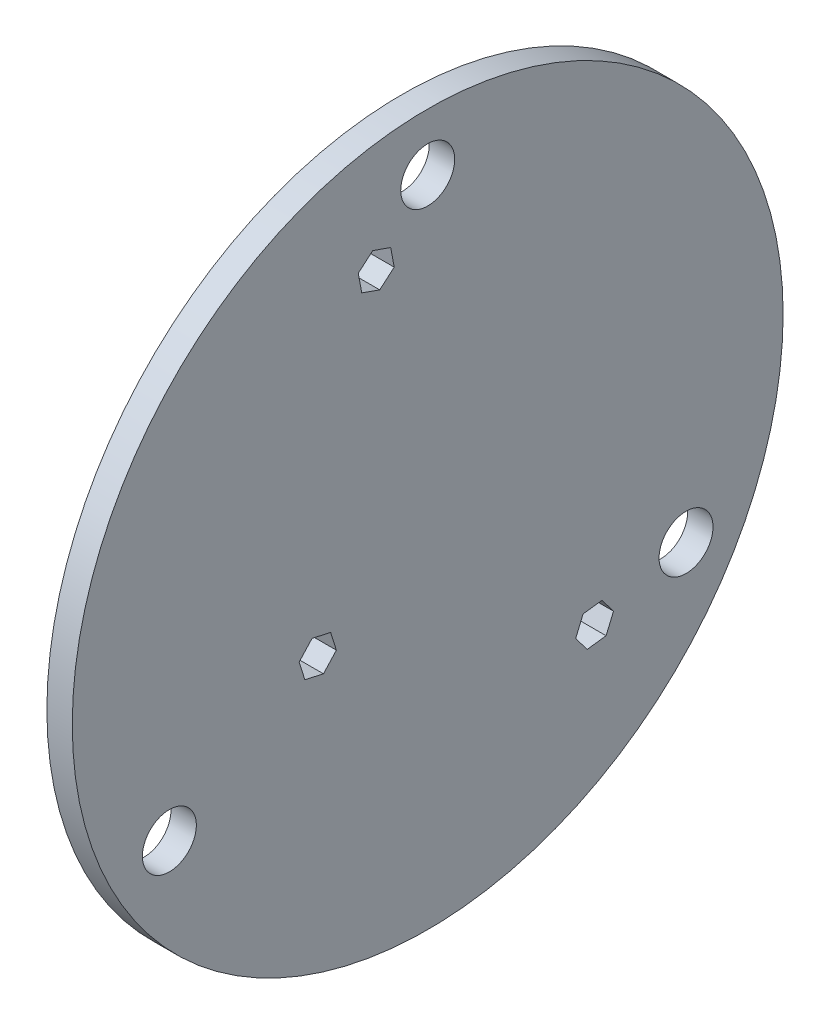
ISO-10303-21;
HEADER;
FILE_DESCRIPTION(('STEP AP214'),'2;1');
FILE_NAME('part.step','',(''),(''),'','','');
FILE_SCHEMA(('AUTOMOTIVE_DESIGN { 1 0 10303 214 1 1 1 1 }'));
ENDSEC;
DATA;
#1=APPLICATION_CONTEXT('core data for automotive mechanical design processes');
#2=APPLICATION_PROTOCOL_DEFINITION('international standard','automotive_design',2000,#1);
#3=PRODUCT_CONTEXT('',#1,'mechanical');
#4=PRODUCT('Part','Part','',(#3));
#5=PRODUCT_RELATED_PRODUCT_CATEGORY('part','',(#4));
#6=PRODUCT_DEFINITION_FORMATION('','',#4);
#7=PRODUCT_DEFINITION_CONTEXT('part definition',#1,'design');
#8=PRODUCT_DEFINITION('design','',#6,#7);
#9=PRODUCT_DEFINITION_SHAPE('','',#8);
#10=(LENGTH_UNIT() NAMED_UNIT(*) SI_UNIT(.MILLI.,.METRE.));
#11=(NAMED_UNIT(*) PLANE_ANGLE_UNIT() SI_UNIT($,.RADIAN.));
#12=(NAMED_UNIT(*) SI_UNIT($,.STERADIAN.) SOLID_ANGLE_UNIT());
#13=UNCERTAINTY_MEASURE_WITH_UNIT(LENGTH_MEASURE(1.E-05),#10,'distance_accuracy_value','');
#14=(GEOMETRIC_REPRESENTATION_CONTEXT(3) GLOBAL_UNCERTAINTY_ASSIGNED_CONTEXT((#13)) GLOBAL_UNIT_ASSIGNED_CONTEXT((#10,
#11,#12)) REPRESENTATION_CONTEXT('',''));
#15=CARTESIAN_POINT('',(0.,0.,0.));
#16=DIRECTION('',(0.,0.,1.));
#17=DIRECTION('',(1.,0.,0.));
#18=AXIS2_PLACEMENT_3D('',#15,#16,#17);
#19=CARTESIAN_POINT('',(4.,0.,0.));
#20=DIRECTION('',(-1.,0.,0.));
#21=DIRECTION('',(0.,0.,1.));
#22=AXIS2_PLACEMENT_3D('',#19,#20,#21);
#23=CYLINDRICAL_SURFACE('',#22,56.);
#24=CARTESIAN_POINT('',(4.,0.,0.));
#25=DIRECTION('',(1.,0.,0.));
#26=DIRECTION('',(0.,0.,-1.));
#27=AXIS2_PLACEMENT_3D('',#24,#25,#26);
#28=CIRCLE('',#27,56.);
#29=CARTESIAN_POINT('',(4.,0.,-56.));
#30=VERTEX_POINT('',#29);
#31=EDGE_CURVE('E11',#30,#30,#28,.T.);
#32=ORIENTED_EDGE('',*,*,#31,.F.);
#33=EDGE_LOOP('',(#32));
#34=FACE_BOUND('',#33,.T.);
#35=CARTESIAN_POINT('',(0.,0.,0.));
#36=DIRECTION('',(1.,0.,0.));
#37=DIRECTION('',(0.,0.,-1.));
#38=AXIS2_PLACEMENT_3D('',#35,#36,#37);
#39=CIRCLE('',#38,56.);
#40=CARTESIAN_POINT('',(0.,0.,-56.));
#41=VERTEX_POINT('',#40);
#42=EDGE_CURVE('E36',#41,#41,#39,.T.);
#43=ORIENTED_EDGE('',*,*,#42,.T.);
#44=EDGE_LOOP('',(#43));
#45=FACE_BOUND('',#44,.T.);
#46=ADVANCED_FACE('F33',(#34,#45),#23,.T.);
#47=CARTESIAN_POINT('',(4.,0.,0.));
#48=DIRECTION('',(1.,0.,0.));
#49=DIRECTION('',(0.,0.,-1.));
#50=AXIS2_PLACEMENT_3D('',#47,#48,#49);
#51=PLANE('',#50);
#52=DIRECTION('',(0.,-0.983088342629937,-0.183131948564752));
#53=VECTOR('',#52,1.);
#54=CARTESIAN_POINT('',(4.,39.0425213038183,10.9386261729049));
#55=LINE('',#54,#53);
#56=CARTESIAN_POINT('',(4.,39.0425213038183,10.9386261729049));
#57=VERTEX_POINT('',#56);
#58=CARTESIAN_POINT('',(4.,36.0910724436945,10.3888235179393));
#59=VERTEX_POINT('',#58);
#60=EDGE_CURVE('E47',#57,#59,#55,.T.);
#61=ORIENTED_EDGE('',*,*,#60,.F.);
#62=DIRECTION('',(0.,-0.650141091016588,0.759813504599491));
#63=VECTOR('',#62,1.);
#64=CARTESIAN_POINT('',(4.,40.9943888001485,8.6574978095499));
#65=LINE('',#64,#63);
#66=CARTESIAN_POINT('',(4.,40.9943888001485,8.6574978095499));
#67=VERTEX_POINT('',#66);
#68=EDGE_CURVE('E179',#67,#57,#65,.T.);
#69=ORIENTED_EDGE('',*,*,#68,.F.);
#70=DIRECTION('',(0.,0.33294725161335,0.942945453164241));
#71=VECTOR('',#70,1.);
#72=CARTESIAN_POINT('',(4.,39.994807436355,5.82656679122926));
#73=LINE('',#72,#71);
#74=CARTESIAN_POINT('',(4.,39.994807436355,5.82656679122926));
#75=VERTEX_POINT('',#74);
#76=EDGE_CURVE('E182',#75,#67,#73,.T.);
#77=ORIENTED_EDGE('',*,*,#76,.F.);
#78=DIRECTION('',(0.,0.983088342629937,0.183131948564751));
#79=VECTOR('',#78,1.);
#80=CARTESIAN_POINT('',(4.,37.0433585762312,5.27676413626364));
#81=LINE('',#80,#79);
#82=CARTESIAN_POINT('',(4.,37.0433585762312,5.27676413626364));
#83=VERTEX_POINT('',#82);
#84=EDGE_CURVE('E199',#83,#75,#81,.T.);
#85=ORIENTED_EDGE('',*,*,#84,.F.);
#86=DIRECTION('',(0.,0.650141091016587,-0.759813504599492));
#87=VECTOR('',#86,1.);
#88=CARTESIAN_POINT('',(4.,35.0914910799009,7.55789249961868));
#89=LINE('',#88,#87);
#90=CARTESIAN_POINT('',(4.,35.0914910799009,7.55789249961868));
#91=VERTEX_POINT('',#90);
#92=EDGE_CURVE('E196',#91,#83,#89,.T.);
#93=ORIENTED_EDGE('',*,*,#92,.F.);
#94=DIRECTION('',(0.,-0.332947251613348,-0.942945453164242));
#95=VECTOR('',#94,1.);
#96=CARTESIAN_POINT('',(4.,36.0910724436945,10.3888235179393));
#97=LINE('',#96,#95);
#98=EDGE_CURVE('E193',#59,#91,#97,.T.);
#99=ORIENTED_EDGE('',*,*,#98,.F.);
#100=EDGE_LOOP('',(#61,#69,#77,#85,#93,#99));
#101=FACE_BOUND('',#100,.T.);
#102=DIRECTION('',(0.,-0.218737299113197,-0.975783784440315));
#103=VECTOR('',#102,1.);
#104=CARTESIAN_POINT('',(4.,-12.2086889393792,19.3539845329892));
#105=LINE('',#104,#103);
#106=CARTESIAN_POINT('',(4.,-12.2086889393792,19.3539845329892));
#107=VERTEX_POINT('',#106);
#108=CARTESIAN_POINT('',(4.,-12.8653867397082,16.4244655737783));
#109=VERTEX_POINT('',#108);
#110=EDGE_CURVE('E55',#107,#109,#105,.T.);
#111=ORIENTED_EDGE('',*,*,#110,.F.);
#112=DIRECTION('',(0.,-0.95442219548283,-0.298459834432934));
#113=VECTOR('',#112,1.);
#114=CARTESIAN_POINT('',(4.,-9.34330219966986,20.2500270349004));
#115=LINE('',#114,#113);
#116=CARTESIAN_POINT('',(4.,-9.34330219966986,20.2500270349004));
#117=VERTEX_POINT('',#116);
#118=EDGE_CURVE('E218',#117,#107,#115,.T.);
#119=ORIENTED_EDGE('',*,*,#118,.F.);
#120=DIRECTION('',(0.,-0.735684896369631,0.677323950007384));
#121=VECTOR('',#120,1.);
#122=CARTESIAN_POINT('',(4.,-7.13461326028956,18.2165505776006));
#123=LINE('',#122,#121);
#124=CARTESIAN_POINT('',(4.,-7.13461326028956,18.2165505776006));
#125=VERTEX_POINT('',#124);
#126=EDGE_CURVE('E244',#125,#117,#123,.T.);
#127=ORIENTED_EDGE('',*,*,#126,.F.);
#128=DIRECTION('',(0.,0.218737299113197,0.975783784440315));
#129=VECTOR('',#128,1.);
#130=CARTESIAN_POINT('',(4.,-7.7913110606186,15.2870316183896));
#131=LINE('',#130,#129);
#132=CARTESIAN_POINT('',(4.,-7.7913110606186,15.2870316183896));
#133=VERTEX_POINT('',#132);
#134=EDGE_CURVE('E241',#133,#125,#131,.T.);
#135=ORIENTED_EDGE('',*,*,#134,.F.);
#136=DIRECTION('',(0.,0.954422195482831,0.29845983443293));
#137=VECTOR('',#136,1.);
#138=CARTESIAN_POINT('',(4.,-10.656697800328,14.3909891164785));
#139=LINE('',#138,#137);
#140=CARTESIAN_POINT('',(4.,-10.656697800328,14.3909891164785));
#141=VERTEX_POINT('',#140);
#142=EDGE_CURVE('E238',#141,#133,#139,.T.);
#143=ORIENTED_EDGE('',*,*,#142,.F.);
#144=DIRECTION('',(0.,0.735684896369631,-0.677323950007384));
#145=VECTOR('',#144,1.);
#146=CARTESIAN_POINT('',(4.,-12.8653867397082,16.4244655737783));
#147=LINE('',#146,#145);
#148=EDGE_CURVE('E235',#109,#141,#147,.T.);
#149=ORIENTED_EDGE('',*,*,#148,.F.);
#150=EDGE_LOOP('',(#111,#119,#127,#135,#143,#149));
#151=FACE_BOUND('',#150,.T.);
#152=DIRECTION('',(0.,0.796914909803169,0.604091571314654));
#153=VECTOR('',#152,1.);
#154=CARTESIAN_POINT('',(4.,-27.1685593526177,-29.2730157209621));
#155=LINE('',#154,#153);
#156=CARTESIAN_POINT('',(4.,-27.1685593526177,-29.2730157209621));
#157=VERTEX_POINT('',#156);
#158=CARTESIAN_POINT('',(4.,-24.776044356598,-27.4593990781309));
#159=VERTEX_POINT('',#158);
#160=EDGE_CURVE('E206',#157,#159,#155,.T.);
#161=ORIENTED_EDGE('',*,*,#160,.F.);
#162=DIRECTION('',(0.,0.921616101872134,-0.388102770886801));
#163=VECTOR('',#162,1.);
#164=CARTESIAN_POINT('',(4.,-29.9354549360456,-28.1078452768895));
#165=LINE('',#164,#163);
#166=CARTESIAN_POINT('',(4.,-29.9354549360456,-28.1078452768895));
#167=VERTEX_POINT('',#166);
#168=EDGE_CURVE('E263',#167,#157,#165,.T.);
#169=ORIENTED_EDGE('',*,*,#168,.F.);
#170=DIRECTION('',(0.,0.124701192068967,-0.992194342201455));
#171=VECTOR('',#170,1.);
#172=CARTESIAN_POINT('',(4.,-30.3098355234538,-25.1290581899856));
#173=LINE('',#172,#171);
#174=CARTESIAN_POINT('',(4.,-30.3098355234538,-25.1290581899856));
#175=VERTEX_POINT('',#174);
#176=EDGE_CURVE('E289',#175,#167,#173,.T.);
#177=ORIENTED_EDGE('',*,*,#176,.F.);
#178=DIRECTION('',(0.,-0.796914909803168,-0.604091571314655));
#179=VECTOR('',#178,1.);
#180=CARTESIAN_POINT('',(4.,-27.9173205274342,-23.3154415471544));
#181=LINE('',#180,#179);
#182=CARTESIAN_POINT('',(4.,-27.9173205274342,-23.3154415471544));
#183=VERTEX_POINT('',#182);
#184=EDGE_CURVE('E286',#183,#175,#181,.T.);
#185=ORIENTED_EDGE('',*,*,#184,.F.);
#186=DIRECTION('',(0.,-0.921616101872134,0.3881027708868));
#187=VECTOR('',#186,1.);
#188=CARTESIAN_POINT('',(4.,-25.1504249440063,-24.480611991227));
#189=LINE('',#188,#187);
#190=CARTESIAN_POINT('',(4.,-25.1504249440063,-24.480611991227));
#191=VERTEX_POINT('',#190);
#192=EDGE_CURVE('E283',#191,#183,#189,.T.);
#193=ORIENTED_EDGE('',*,*,#192,.F.);
#194=DIRECTION('',(0.,-0.124701192068966,0.992194342201456));
#195=VECTOR('',#194,1.);
#196=CARTESIAN_POINT('',(4.,-24.776044356598,-27.4593990781309));
#197=LINE('',#196,#195);
#198=EDGE_CURVE('E280',#159,#191,#197,.T.);
#199=ORIENTED_EDGE('',*,*,#198,.F.);
#200=EDGE_LOOP('',(#161,#169,#177,#185,#193,#199));
#201=FACE_BOUND('',#200,.T.);
#202=CARTESIAN_POINT('',(4.,-23.4999999999981,40.7031939778718));
#203=DIRECTION('',(-1.,0.,0.));
#204=DIRECTION('',(0.,0.,1.));
#205=AXIS2_PLACEMENT_3D('',#202,#203,#204);
#206=CIRCLE('',#205,4.25000000000406);
#207=CARTESIAN_POINT('',(4.,-23.4999999999981,44.9531939778759));
#208=VERTEX_POINT('',#207);
#209=EDGE_CURVE('E307',#208,#208,#206,.T.);
#210=ORIENTED_EDGE('',*,*,#209,.T.);
#211=EDGE_LOOP('',(#210));
#212=FACE_BOUND('',#211,.T.);
#213=CARTESIAN_POINT('',(4.,-23.5000000000019,-40.7031939778654));
#214=DIRECTION('',(-1.,0.,0.));
#215=DIRECTION('',(0.,0.,1.));
#216=AXIS2_PLACEMENT_3D('',#213,#214,#215);
#217=CIRCLE('',#216,4.25000000000406);
#218=CARTESIAN_POINT('',(4.,-23.5000000000019,-36.4531939778614));
#219=VERTEX_POINT('',#218);
#220=EDGE_CURVE('E314',#219,#219,#217,.T.);
#221=ORIENTED_EDGE('',*,*,#220,.T.);
#222=EDGE_LOOP('',(#221));
#223=FACE_BOUND('',#222,.T.);
#224=CARTESIAN_POINT('',(4.,47.,0.));
#225=DIRECTION('',(-1.,0.,0.));
#226=DIRECTION('',(0.,0.,1.));
#227=AXIS2_PLACEMENT_3D('',#224,#225,#226);
#228=CIRCLE('',#227,4.25000000000406);
#229=CARTESIAN_POINT('',(4.,47.,4.25000000000406));
#230=VERTEX_POINT('',#229);
#231=EDGE_CURVE('E319',#230,#230,#228,.T.);
#232=ORIENTED_EDGE('',*,*,#231,.T.);
#233=EDGE_LOOP('',(#232));
#234=FACE_BOUND('',#233,.T.);
#235=ORIENTED_EDGE('',*,*,#31,.T.);
#236=EDGE_LOOP('',(#235));
#237=FACE_BOUND('',#236,.T.);
#238=ADVANCED_FACE('F329',(#101,#151,#201,#212,#223,#234,#237),#51,.T.);
#239=CARTESIAN_POINT('',(0.,0.,0.));
#240=DIRECTION('',(1.,0.,0.));
#241=DIRECTION('',(0.,0.,-1.));
#242=AXIS2_PLACEMENT_3D('',#239,#240,#241);
#243=PLANE('',#242);
#244=DIRECTION('',(0.,-0.650141091016588,0.759813504599491));
#245=VECTOR('',#244,1.);
#246=CARTESIAN_POINT('',(0.,40.9943888001485,8.6574978095499));
#247=LINE('',#246,#245);
#248=CARTESIAN_POINT('',(0.,40.9943888001485,8.6574978095499));
#249=VERTEX_POINT('',#248);
#250=CARTESIAN_POINT('',(0.,39.0425213038183,10.9386261729049));
#251=VERTEX_POINT('',#250);
#252=EDGE_CURVE('E165',#249,#251,#247,.T.);
#253=ORIENTED_EDGE('',*,*,#252,.T.);
#254=DIRECTION('',(0.,-0.983088342629937,-0.183131948564752));
#255=VECTOR('',#254,1.);
#256=CARTESIAN_POINT('',(0.,39.0425213038183,10.9386261729049));
#257=LINE('',#256,#255);
#258=CARTESIAN_POINT('',(0.,36.0910724436945,10.3888235179393));
#259=VERTEX_POINT('',#258);
#260=EDGE_CURVE('E159',#251,#259,#257,.T.);
#261=ORIENTED_EDGE('',*,*,#260,.T.);
#262=DIRECTION('',(0.,-0.332947251613348,-0.942945453164242));
#263=VECTOR('',#262,1.);
#264=CARTESIAN_POINT('',(0.,36.0910724436945,10.3888235179393));
#265=LINE('',#264,#263);
#266=CARTESIAN_POINT('',(0.,35.0914910799009,7.55789249961868));
#267=VERTEX_POINT('',#266);
#268=EDGE_CURVE('E169',#259,#267,#265,.T.);
#269=ORIENTED_EDGE('',*,*,#268,.T.);
#270=DIRECTION('',(0.,0.650141091016587,-0.759813504599492));
#271=VECTOR('',#270,1.);
#272=CARTESIAN_POINT('',(0.,35.0914910799009,7.55789249961868));
#273=LINE('',#272,#271);
#274=CARTESIAN_POINT('',(0.,37.0433585762312,5.27676413626364));
#275=VERTEX_POINT('',#274);
#276=EDGE_CURVE('E173',#267,#275,#273,.T.);
#277=ORIENTED_EDGE('',*,*,#276,.T.);
#278=DIRECTION('',(0.,0.983088342629937,0.183131948564751));
#279=VECTOR('',#278,1.);
#280=CARTESIAN_POINT('',(0.,37.0433585762312,5.27676413626364));
#281=LINE('',#280,#279);
#282=CARTESIAN_POINT('',(0.,39.994807436355,5.82656679122926));
#283=VERTEX_POINT('',#282);
#284=EDGE_CURVE('E186',#275,#283,#281,.T.);
#285=ORIENTED_EDGE('',*,*,#284,.T.);
#286=DIRECTION('',(0.,0.33294725161335,0.942945453164241));
#287=VECTOR('',#286,1.);
#288=CARTESIAN_POINT('',(0.,39.994807436355,5.82656679122926));
#289=LINE('',#288,#287);
#290=EDGE_CURVE('E189',#283,#249,#289,.T.);
#291=ORIENTED_EDGE('',*,*,#290,.T.);
#292=EDGE_LOOP('',(#253,#261,#269,#277,#285,#291));
#293=FACE_BOUND('',#292,.T.);
#294=DIRECTION('',(0.,-0.95442219548283,-0.298459834432934));
#295=VECTOR('',#294,1.);
#296=CARTESIAN_POINT('',(0.,-9.34330219966986,20.2500270349004));
#297=LINE('',#296,#295);
#298=CARTESIAN_POINT('',(0.,-9.34330219966986,20.2500270349004));
#299=VERTEX_POINT('',#298);
#300=CARTESIAN_POINT('',(0.,-12.2086889393792,19.3539845329892));
#301=VERTEX_POINT('',#300);
#302=EDGE_CURVE('E230',#299,#301,#297,.T.);
#303=ORIENTED_EDGE('',*,*,#302,.T.);
#304=DIRECTION('',(0.,-0.218737299113197,-0.975783784440315));
#305=VECTOR('',#304,1.);
#306=CARTESIAN_POINT('',(0.,-12.2086889393792,19.3539845329892));
#307=LINE('',#306,#305);
#308=CARTESIAN_POINT('',(0.,-12.8653867397082,16.4244655737783));
#309=VERTEX_POINT('',#308);
#310=EDGE_CURVE('E214',#301,#309,#307,.T.);
#311=ORIENTED_EDGE('',*,*,#310,.T.);
#312=DIRECTION('',(0.,0.735684896369631,-0.677323950007384));
#313=VECTOR('',#312,1.);
#314=CARTESIAN_POINT('',(0.,-12.8653867397082,16.4244655737783));
#315=LINE('',#314,#313);
#316=CARTESIAN_POINT('',(0.,-10.656697800328,14.3909891164785));
#317=VERTEX_POINT('',#316);
#318=EDGE_CURVE('E217',#309,#317,#315,.T.);
#319=ORIENTED_EDGE('',*,*,#318,.T.);
#320=DIRECTION('',(0.,0.954422195482831,0.29845983443293));
#321=VECTOR('',#320,1.);
#322=CARTESIAN_POINT('',(0.,-10.656697800328,14.3909891164785));
#323=LINE('',#322,#321);
#324=CARTESIAN_POINT('',(0.,-7.7913110606186,15.2870316183896));
#325=VERTEX_POINT('',#324);
#326=EDGE_CURVE('E221',#317,#325,#323,.T.);
#327=ORIENTED_EDGE('',*,*,#326,.T.);
#328=DIRECTION('',(0.,0.218737299113197,0.975783784440315));
#329=VECTOR('',#328,1.);
#330=CARTESIAN_POINT('',(0.,-7.7913110606186,15.2870316183896));
#331=LINE('',#330,#329);
#332=CARTESIAN_POINT('',(0.,-7.13461326028956,18.2165505776006));
#333=VERTEX_POINT('',#332);
#334=EDGE_CURVE('E224',#325,#333,#331,.T.);
#335=ORIENTED_EDGE('',*,*,#334,.T.);
#336=DIRECTION('',(0.,-0.735684896369631,0.677323950007384));
#337=VECTOR('',#336,1.);
#338=CARTESIAN_POINT('',(0.,-7.13461326028956,18.2165505776006));
#339=LINE('',#338,#337);
#340=EDGE_CURVE('E227',#333,#299,#339,.T.);
#341=ORIENTED_EDGE('',*,*,#340,.T.);
#342=EDGE_LOOP('',(#303,#311,#319,#327,#335,#341));
#343=FACE_BOUND('',#342,.T.);
#344=DIRECTION('',(0.,0.921616101872134,-0.388102770886801));
#345=VECTOR('',#344,1.);
#346=CARTESIAN_POINT('',(0.,-29.9354549360456,-28.1078452768895));
#347=LINE('',#346,#345);
#348=CARTESIAN_POINT('',(0.,-29.9354549360456,-28.1078452768895));
#349=VERTEX_POINT('',#348);
#350=CARTESIAN_POINT('',(0.,-27.1685593526177,-29.2730157209621));
#351=VERTEX_POINT('',#350);
#352=EDGE_CURVE('E275',#349,#351,#347,.T.);
#353=ORIENTED_EDGE('',*,*,#352,.T.);
#354=DIRECTION('',(0.,0.796914909803169,0.604091571314654));
#355=VECTOR('',#354,1.);
#356=CARTESIAN_POINT('',(0.,-27.1685593526177,-29.2730157209621));
#357=LINE('',#356,#355);
#358=CARTESIAN_POINT('',(0.,-24.776044356598,-27.4593990781309));
#359=VERTEX_POINT('',#358);
#360=EDGE_CURVE('E259',#351,#359,#357,.T.);
#361=ORIENTED_EDGE('',*,*,#360,.T.);
#362=DIRECTION('',(0.,-0.124701192068966,0.992194342201456));
#363=VECTOR('',#362,1.);
#364=CARTESIAN_POINT('',(0.,-24.776044356598,-27.4593990781309));
#365=LINE('',#364,#363);
#366=CARTESIAN_POINT('',(0.,-25.1504249440063,-24.480611991227));
#367=VERTEX_POINT('',#366);
#368=EDGE_CURVE('E262',#359,#367,#365,.T.);
#369=ORIENTED_EDGE('',*,*,#368,.T.);
#370=DIRECTION('',(0.,-0.921616101872134,0.3881027708868));
#371=VECTOR('',#370,1.);
#372=CARTESIAN_POINT('',(0.,-25.1504249440063,-24.480611991227));
#373=LINE('',#372,#371);
#374=CARTESIAN_POINT('',(0.,-27.9173205274342,-23.3154415471544));
#375=VERTEX_POINT('',#374);
#376=EDGE_CURVE('E266',#367,#375,#373,.T.);
#377=ORIENTED_EDGE('',*,*,#376,.T.);
#378=DIRECTION('',(0.,-0.796914909803168,-0.604091571314655));
#379=VECTOR('',#378,1.);
#380=CARTESIAN_POINT('',(0.,-27.9173205274342,-23.3154415471544));
#381=LINE('',#380,#379);
#382=CARTESIAN_POINT('',(0.,-30.3098355234538,-25.1290581899856));
#383=VERTEX_POINT('',#382);
#384=EDGE_CURVE('E269',#375,#383,#381,.T.);
#385=ORIENTED_EDGE('',*,*,#384,.T.);
#386=DIRECTION('',(0.,0.124701192068967,-0.992194342201455));
#387=VECTOR('',#386,1.);
#388=CARTESIAN_POINT('',(0.,-30.3098355234538,-25.1290581899856));
#389=LINE('',#388,#387);
#390=EDGE_CURVE('E272',#383,#349,#389,.T.);
#391=ORIENTED_EDGE('',*,*,#390,.T.);
#392=EDGE_LOOP('',(#353,#361,#369,#377,#385,#391));
#393=FACE_BOUND('',#392,.T.);
#394=CARTESIAN_POINT('',(0.,-23.4999999999981,40.7031939778718));
#395=DIRECTION('',(-1.,0.,0.));
#396=DIRECTION('',(0.,0.,1.));
#397=AXIS2_PLACEMENT_3D('',#394,#395,#396);
#398=CIRCLE('',#397,4.25000000000406);
#399=CARTESIAN_POINT('',(0.,-23.4999999999981,44.9531939778759));
#400=VERTEX_POINT('',#399);
#401=EDGE_CURVE('E311',#400,#400,#398,.T.);
#402=ORIENTED_EDGE('',*,*,#401,.F.);
#403=EDGE_LOOP('',(#402));
#404=FACE_BOUND('',#403,.T.);
#405=CARTESIAN_POINT('',(0.,-23.5000000000019,-40.7031939778654));
#406=DIRECTION('',(-1.,0.,0.));
#407=DIRECTION('',(0.,0.,1.));
#408=AXIS2_PLACEMENT_3D('',#405,#406,#407);
#409=CIRCLE('',#408,4.25000000000406);
#410=CARTESIAN_POINT('',(0.,-23.5000000000019,-36.4531939778614));
#411=VERTEX_POINT('',#410);
#412=EDGE_CURVE('E296',#411,#411,#409,.T.);
#413=ORIENTED_EDGE('',*,*,#412,.F.);
#414=EDGE_LOOP('',(#413));
#415=FACE_BOUND('',#414,.T.);
#416=CARTESIAN_POINT('',(0.,47.,0.));
#417=DIRECTION('',(-1.,0.,0.));
#418=DIRECTION('',(0.,0.,1.));
#419=AXIS2_PLACEMENT_3D('',#416,#417,#418);
#420=CIRCLE('',#419,4.25000000000406);
#421=CARTESIAN_POINT('',(0.,47.,4.25000000000406));
#422=VERTEX_POINT('',#421);
#423=EDGE_CURVE('E310',#422,#422,#420,.T.);
#424=ORIENTED_EDGE('',*,*,#423,.F.);
#425=EDGE_LOOP('',(#424));
#426=FACE_BOUND('',#425,.T.);
#427=ORIENTED_EDGE('',*,*,#42,.F.);
#428=EDGE_LOOP('',(#427));
#429=FACE_BOUND('',#428,.T.);
#430=ADVANCED_FACE('F175',(#293,#343,#393,#404,#415,#426,#429),#243,.F.);
#431=CARTESIAN_POINT('',(4.,47.,0.));
#432=DIRECTION('',(-1.,0.,0.));
#433=DIRECTION('',(0.,0.,1.));
#434=AXIS2_PLACEMENT_3D('',#431,#432,#433);
#435=CYLINDRICAL_SURFACE('',#434,4.25000000000406);
#436=ORIENTED_EDGE('',*,*,#231,.F.);
#437=EDGE_LOOP('',(#436));
#438=FACE_BOUND('',#437,.T.);
#439=ORIENTED_EDGE('',*,*,#423,.T.);
#440=EDGE_LOOP('',(#439));
#441=FACE_BOUND('',#440,.T.);
#442=ADVANCED_FACE('F325',(#438,#441),#435,.F.);
#443=CARTESIAN_POINT('',(4.,-23.5000000000019,-40.7031939778654));
#444=DIRECTION('',(-1.,0.,0.));
#445=DIRECTION('',(0.,0.,1.));
#446=AXIS2_PLACEMENT_3D('',#443,#444,#445);
#447=CYLINDRICAL_SURFACE('',#446,4.25000000000406);
#448=ORIENTED_EDGE('',*,*,#220,.F.);
#449=EDGE_LOOP('',(#448));
#450=FACE_BOUND('',#449,.T.);
#451=ORIENTED_EDGE('',*,*,#412,.T.);
#452=EDGE_LOOP('',(#451));
#453=FACE_BOUND('',#452,.T.);
#454=ADVANCED_FACE('F348',(#450,#453),#447,.F.);
#455=CARTESIAN_POINT('',(4.,-23.4999999999981,40.7031939778718));
#456=DIRECTION('',(-1.,0.,0.));
#457=DIRECTION('',(0.,0.,1.));
#458=AXIS2_PLACEMENT_3D('',#455,#456,#457);
#459=CYLINDRICAL_SURFACE('',#458,4.25000000000406);
#460=ORIENTED_EDGE('',*,*,#209,.F.);
#461=EDGE_LOOP('',(#460));
#462=FACE_BOUND('',#461,.T.);
#463=ORIENTED_EDGE('',*,*,#401,.T.);
#464=EDGE_LOOP('',(#463));
#465=FACE_BOUND('',#464,.T.);
#466=ADVANCED_FACE('F352',(#462,#465),#459,.F.);
#467=CARTESIAN_POINT('',(0.,-27.1685593526177,-29.2730157209621));
#468=DIRECTION('',(0.,0.604091571314654,-0.796914909803169));
#469=DIRECTION('',(0.,0.796914909803169,0.604091571314654));
#470=AXIS2_PLACEMENT_3D('',#467,#468,#469);
#471=PLANE('',#470);
#472=ORIENTED_EDGE('',*,*,#160,.T.);
#473=DIRECTION('',(1.,0.,0.));
#474=VECTOR('',#473,1.);
#475=CARTESIAN_POINT('',(0.,-24.776044356598,-27.4593990781309));
#476=LINE('',#475,#474);
#477=EDGE_CURVE('E278',#359,#159,#476,.T.);
#478=ORIENTED_EDGE('',*,*,#477,.F.);
#479=ORIENTED_EDGE('',*,*,#360,.F.);
#480=DIRECTION('',(1.,0.,0.));
#481=VECTOR('',#480,1.);
#482=CARTESIAN_POINT('',(0.,-27.1685593526177,-29.2730157209621));
#483=LINE('',#482,#481);
#484=EDGE_CURVE('E294',#351,#157,#483,.T.);
#485=ORIENTED_EDGE('',*,*,#484,.T.);
#486=EDGE_LOOP('',(#472,#478,#479,#485));
#487=FACE_BOUND('',#486,.T.);
#488=ADVANCED_FACE('F356',(#487),#471,.F.);
#489=CARTESIAN_POINT('',(0.,-29.9354549360456,-28.1078452768895));
#490=DIRECTION('',(0.,-0.388102770886801,-0.921616101872134));
#491=DIRECTION('',(0.,0.921616101872134,-0.388102770886801));
#492=AXIS2_PLACEMENT_3D('',#489,#490,#491);
#493=PLANE('',#492);
#494=ORIENTED_EDGE('',*,*,#168,.T.);
#495=ORIENTED_EDGE('',*,*,#484,.F.);
#496=ORIENTED_EDGE('',*,*,#352,.F.);
#497=DIRECTION('',(1.,0.,0.));
#498=VECTOR('',#497,1.);
#499=CARTESIAN_POINT('',(0.,-29.9354549360456,-28.1078452768895));
#500=LINE('',#499,#498);
#501=EDGE_CURVE('E297',#349,#167,#500,.T.);
#502=ORIENTED_EDGE('',*,*,#501,.T.);
#503=EDGE_LOOP('',(#494,#495,#496,#502));
#504=FACE_BOUND('',#503,.T.);
#505=ADVANCED_FACE('F360',(#504),#493,.F.);
#506=CARTESIAN_POINT('',(0.,-30.3098355234538,-25.1290581899856));
#507=DIRECTION('',(0.,-0.992194342201455,-0.124701192068967));
#508=DIRECTION('',(0.,0.124701192068967,-0.992194342201455));
#509=AXIS2_PLACEMENT_3D('',#506,#507,#508);
#510=PLANE('',#509);
#511=ORIENTED_EDGE('',*,*,#176,.T.);
#512=ORIENTED_EDGE('',*,*,#501,.F.);
#513=ORIENTED_EDGE('',*,*,#390,.F.);
#514=DIRECTION('',(1.,0.,0.));
#515=VECTOR('',#514,1.);
#516=CARTESIAN_POINT('',(0.,-30.3098355234538,-25.1290581899856));
#517=LINE('',#516,#515);
#518=EDGE_CURVE('E299',#383,#175,#517,.T.);
#519=ORIENTED_EDGE('',*,*,#518,.T.);
#520=EDGE_LOOP('',(#511,#512,#513,#519));
#521=FACE_BOUND('',#520,.T.);
#522=ADVANCED_FACE('F374',(#521),#510,.F.);
#523=CARTESIAN_POINT('',(0.,-27.9173205274342,-23.3154415471544));
#524=DIRECTION('',(0.,-0.604091571314655,0.796914909803168));
#525=DIRECTION('',(0.,-0.796914909803168,-0.604091571314655));
#526=AXIS2_PLACEMENT_3D('',#523,#524,#525);
#527=PLANE('',#526);
#528=ORIENTED_EDGE('',*,*,#184,.T.);
#529=ORIENTED_EDGE('',*,*,#518,.F.);
#530=ORIENTED_EDGE('',*,*,#384,.F.);
#531=DIRECTION('',(1.,0.,0.));
#532=VECTOR('',#531,1.);
#533=CARTESIAN_POINT('',(0.,-27.9173205274342,-23.3154415471544));
#534=LINE('',#533,#532);
#535=EDGE_CURVE('E301',#375,#183,#534,.T.);
#536=ORIENTED_EDGE('',*,*,#535,.T.);
#537=EDGE_LOOP('',(#528,#529,#530,#536));
#538=FACE_BOUND('',#537,.T.);
#539=ADVANCED_FACE('F370',(#538),#527,.F.);
#540=CARTESIAN_POINT('',(0.,-25.1504249440063,-24.480611991227));
#541=DIRECTION('',(0.,0.3881027708868,0.921616101872134));
#542=DIRECTION('',(0.,-0.921616101872134,0.3881027708868));
#543=AXIS2_PLACEMENT_3D('',#540,#541,#542);
#544=PLANE('',#543);
#545=ORIENTED_EDGE('',*,*,#192,.T.);
#546=ORIENTED_EDGE('',*,*,#535,.F.);
#547=ORIENTED_EDGE('',*,*,#376,.F.);
#548=DIRECTION('',(1.,0.,0.));
#549=VECTOR('',#548,1.);
#550=CARTESIAN_POINT('',(0.,-25.1504249440063,-24.480611991227));
#551=LINE('',#550,#549);
#552=EDGE_CURVE('E303',#367,#191,#551,.T.);
#553=ORIENTED_EDGE('',*,*,#552,.T.);
#554=EDGE_LOOP('',(#545,#546,#547,#553));
#555=FACE_BOUND('',#554,.T.);
#556=ADVANCED_FACE('F366',(#555),#544,.F.);
#557=CARTESIAN_POINT('',(0.,-24.776044356598,-27.4593990781309));
#558=DIRECTION('',(0.,0.992194342201455,0.124701192068966));
#559=DIRECTION('',(0.,-0.124701192068966,0.992194342201455));
#560=AXIS2_PLACEMENT_3D('',#557,#558,#559);
#561=PLANE('',#560);
#562=ORIENTED_EDGE('',*,*,#198,.T.);
#563=ORIENTED_EDGE('',*,*,#552,.F.);
#564=ORIENTED_EDGE('',*,*,#368,.F.);
#565=ORIENTED_EDGE('',*,*,#477,.T.);
#566=EDGE_LOOP('',(#562,#563,#564,#565));
#567=FACE_BOUND('',#566,.T.);
#568=ADVANCED_FACE('F362',(#567),#561,.F.);
#569=CARTESIAN_POINT('',(0.,-12.2086889393792,19.3539845329892));
#570=DIRECTION('',(0.,-0.975783784440315,0.218737299113197));
#571=DIRECTION('',(0.,-0.218737299113197,-0.975783784440315));
#572=AXIS2_PLACEMENT_3D('',#569,#570,#571);
#573=PLANE('',#572);
#574=ORIENTED_EDGE('',*,*,#110,.T.);
#575=DIRECTION('',(1.,0.,0.));
#576=VECTOR('',#575,1.);
#577=CARTESIAN_POINT('',(0.,-12.8653867397082,16.4244655737783));
#578=LINE('',#577,#576);
#579=EDGE_CURVE('E233',#309,#109,#578,.T.);
#580=ORIENTED_EDGE('',*,*,#579,.F.);
#581=ORIENTED_EDGE('',*,*,#310,.F.);
#582=DIRECTION('',(1.,0.,0.));
#583=VECTOR('',#582,1.);
#584=CARTESIAN_POINT('',(0.,-12.2086889393792,19.3539845329892));
#585=LINE('',#584,#583);
#586=EDGE_CURVE('E194',#301,#107,#585,.T.);
#587=ORIENTED_EDGE('',*,*,#586,.T.);
#588=EDGE_LOOP('',(#574,#580,#581,#587));
#589=FACE_BOUND('',#588,.T.);
#590=ADVANCED_FACE('F365',(#589),#573,.F.);
#591=CARTESIAN_POINT('',(0.,-9.34330219966986,20.2500270349004));
#592=DIRECTION('',(0.,-0.298459834432934,0.95442219548283));
#593=DIRECTION('',(0.,-0.95442219548283,-0.298459834432934));
#594=AXIS2_PLACEMENT_3D('',#591,#592,#593);
#595=PLANE('',#594);
#596=ORIENTED_EDGE('',*,*,#118,.T.);
#597=ORIENTED_EDGE('',*,*,#586,.F.);
#598=ORIENTED_EDGE('',*,*,#302,.F.);
#599=DIRECTION('',(1.,0.,0.));
#600=VECTOR('',#599,1.);
#601=CARTESIAN_POINT('',(0.,-9.34330219966986,20.2500270349004));
#602=LINE('',#601,#600);
#603=EDGE_CURVE('E250',#299,#117,#602,.T.);
#604=ORIENTED_EDGE('',*,*,#603,.T.);
#605=EDGE_LOOP('',(#596,#597,#598,#604));
#606=FACE_BOUND('',#605,.T.);
#607=ADVANCED_FACE('F384',(#606),#595,.F.);
#608=CARTESIAN_POINT('',(0.,-7.13461326028956,18.2165505776006));
#609=DIRECTION('',(0.,0.677323950007384,0.735684896369631));
#610=DIRECTION('',(0.,-0.735684896369631,0.677323950007384));
#611=AXIS2_PLACEMENT_3D('',#608,#609,#610);
#612=PLANE('',#611);
#613=ORIENTED_EDGE('',*,*,#126,.T.);
#614=ORIENTED_EDGE('',*,*,#603,.F.);
#615=ORIENTED_EDGE('',*,*,#340,.F.);
#616=DIRECTION('',(1.,0.,0.));
#617=VECTOR('',#616,1.);
#618=CARTESIAN_POINT('',(0.,-7.13461326028956,18.2165505776006));
#619=LINE('',#618,#617);
#620=EDGE_CURVE('E252',#333,#125,#619,.T.);
#621=ORIENTED_EDGE('',*,*,#620,.T.);
#622=EDGE_LOOP('',(#613,#614,#615,#621));
#623=FACE_BOUND('',#622,.T.);
#624=ADVANCED_FACE('F396',(#623),#612,.F.);
#625=CARTESIAN_POINT('',(0.,-7.7913110606186,15.2870316183896));
#626=DIRECTION('',(0.,0.975783784440315,-0.218737299113197));
#627=DIRECTION('',(0.,0.218737299113197,0.975783784440315));
#628=AXIS2_PLACEMENT_3D('',#625,#626,#627);
#629=PLANE('',#628);
#630=ORIENTED_EDGE('',*,*,#134,.T.);
#631=ORIENTED_EDGE('',*,*,#620,.F.);
#632=ORIENTED_EDGE('',*,*,#334,.F.);
#633=DIRECTION('',(1.,0.,0.));
#634=VECTOR('',#633,1.);
#635=CARTESIAN_POINT('',(0.,-7.7913110606186,15.2870316183896));
#636=LINE('',#635,#634);
#637=EDGE_CURVE('E254',#325,#133,#636,.T.);
#638=ORIENTED_EDGE('',*,*,#637,.T.);
#639=EDGE_LOOP('',(#630,#631,#632,#638));
#640=FACE_BOUND('',#639,.T.);
#641=ADVANCED_FACE('F392',(#640),#629,.F.);
#642=CARTESIAN_POINT('',(0.,-10.656697800328,14.3909891164785));
#643=DIRECTION('',(0.,0.29845983443293,-0.954422195482831));
#644=DIRECTION('',(0.,0.954422195482831,0.29845983443293));
#645=AXIS2_PLACEMENT_3D('',#642,#643,#644);
#646=PLANE('',#645);
#647=ORIENTED_EDGE('',*,*,#142,.T.);
#648=ORIENTED_EDGE('',*,*,#637,.F.);
#649=ORIENTED_EDGE('',*,*,#326,.F.);
#650=DIRECTION('',(1.,0.,0.));
#651=VECTOR('',#650,1.);
#652=CARTESIAN_POINT('',(0.,-10.656697800328,14.3909891164785));
#653=LINE('',#652,#651);
#654=EDGE_CURVE('E256',#317,#141,#653,.T.);
#655=ORIENTED_EDGE('',*,*,#654,.T.);
#656=EDGE_LOOP('',(#647,#648,#649,#655));
#657=FACE_BOUND('',#656,.T.);
#658=ADVANCED_FACE('F388',(#657),#646,.F.);
#659=CARTESIAN_POINT('',(0.,-12.8653867397082,16.4244655737783));
#660=DIRECTION('',(0.,-0.677323950007384,-0.735684896369631));
#661=DIRECTION('',(0.,0.735684896369631,-0.677323950007384));
#662=AXIS2_PLACEMENT_3D('',#659,#660,#661);
#663=PLANE('',#662);
#664=ORIENTED_EDGE('',*,*,#148,.T.);
#665=ORIENTED_EDGE('',*,*,#654,.F.);
#666=ORIENTED_EDGE('',*,*,#318,.F.);
#667=ORIENTED_EDGE('',*,*,#579,.T.);
#668=EDGE_LOOP('',(#664,#665,#666,#667));
#669=FACE_BOUND('',#668,.T.);
#670=ADVANCED_FACE('F385',(#669),#663,.F.);
#671=CARTESIAN_POINT('',(0.,39.0425213038183,10.9386261729049));
#672=DIRECTION('',(0.,-0.183131948564752,0.983088342629937));
#673=DIRECTION('',(0.,-0.983088342629937,-0.183131948564752));
#674=AXIS2_PLACEMENT_3D('',#671,#672,#673);
#675=PLANE('',#674);
#676=ORIENTED_EDGE('',*,*,#60,.T.);
#677=DIRECTION('',(1.,0.,0.));
#678=VECTOR('',#677,1.);
#679=CARTESIAN_POINT('',(0.,36.0910724436945,10.3888235179393));
#680=LINE('',#679,#678);
#681=EDGE_CURVE('E155',#259,#59,#680,.T.);
#682=ORIENTED_EDGE('',*,*,#681,.F.);
#683=ORIENTED_EDGE('',*,*,#260,.F.);
#684=DIRECTION('',(1.,0.,0.));
#685=VECTOR('',#684,1.);
#686=CARTESIAN_POINT('',(0.,39.0425213038183,10.9386261729049));
#687=LINE('',#686,#685);
#688=EDGE_CURVE('E204',#251,#57,#687,.T.);
#689=ORIENTED_EDGE('',*,*,#688,.T.);
#690=EDGE_LOOP('',(#676,#682,#683,#689));
#691=FACE_BOUND('',#690,.T.);
#692=ADVANCED_FACE('F157',(#691),#675,.F.);
#693=CARTESIAN_POINT('',(0.,40.9943888001485,8.6574978095499));
#694=DIRECTION('',(0.,0.759813504599491,0.650141091016588));
#695=DIRECTION('',(0.,-0.650141091016588,0.759813504599491));
#696=AXIS2_PLACEMENT_3D('',#693,#694,#695);
#697=PLANE('',#696);
#698=ORIENTED_EDGE('',*,*,#68,.T.);
#699=ORIENTED_EDGE('',*,*,#688,.F.);
#700=ORIENTED_EDGE('',*,*,#252,.F.);
#701=DIRECTION('',(1.,0.,0.));
#702=VECTOR('',#701,1.);
#703=CARTESIAN_POINT('',(0.,40.9943888001485,8.6574978095499));
#704=LINE('',#703,#702);
#705=EDGE_CURVE('E207',#249,#67,#704,.T.);
#706=ORIENTED_EDGE('',*,*,#705,.T.);
#707=EDGE_LOOP('',(#698,#699,#700,#706));
#708=FACE_BOUND('',#707,.T.);
#709=ADVANCED_FACE('F406',(#708),#697,.F.);
#710=CARTESIAN_POINT('',(0.,39.994807436355,5.82656679122926));
#711=DIRECTION('',(0.,0.942945453164241,-0.33294725161335));
#712=DIRECTION('',(0.,0.33294725161335,0.942945453164241));
#713=AXIS2_PLACEMENT_3D('',#710,#711,#712);
#714=PLANE('',#713);
#715=ORIENTED_EDGE('',*,*,#76,.T.);
#716=ORIENTED_EDGE('',*,*,#705,.F.);
#717=ORIENTED_EDGE('',*,*,#290,.F.);
#718=DIRECTION('',(1.,0.,0.));
#719=VECTOR('',#718,1.);
#720=CARTESIAN_POINT('',(0.,39.994807436355,5.82656679122926));
#721=LINE('',#720,#719);
#722=EDGE_CURVE('E209',#283,#75,#721,.T.);
#723=ORIENTED_EDGE('',*,*,#722,.T.);
#724=EDGE_LOOP('',(#715,#716,#717,#723));
#725=FACE_BOUND('',#724,.T.);
#726=ADVANCED_FACE('F416',(#725),#714,.F.);
#727=CARTESIAN_POINT('',(0.,37.0433585762312,5.27676413626364));
#728=DIRECTION('',(0.,0.183131948564751,-0.983088342629937));
#729=DIRECTION('',(0.,0.983088342629937,0.183131948564751));
#730=AXIS2_PLACEMENT_3D('',#727,#728,#729);
#731=PLANE('',#730);
#732=ORIENTED_EDGE('',*,*,#84,.T.);
#733=ORIENTED_EDGE('',*,*,#722,.F.);
#734=ORIENTED_EDGE('',*,*,#284,.F.);
#735=DIRECTION('',(1.,0.,0.));
#736=VECTOR('',#735,1.);
#737=CARTESIAN_POINT('',(0.,37.0433585762312,5.27676413626364));
#738=LINE('',#737,#736);
#739=EDGE_CURVE('E211',#275,#83,#738,.T.);
#740=ORIENTED_EDGE('',*,*,#739,.T.);
#741=EDGE_LOOP('',(#732,#733,#734,#740));
#742=FACE_BOUND('',#741,.T.);
#743=ADVANCED_FACE('F412',(#742),#731,.F.);
#744=CARTESIAN_POINT('',(0.,35.0914910799009,7.55789249961868));
#745=DIRECTION('',(0.,-0.759813504599492,-0.650141091016587));
#746=DIRECTION('',(0.,0.650141091016587,-0.759813504599492));
#747=AXIS2_PLACEMENT_3D('',#744,#745,#746);
#748=PLANE('',#747);
#749=ORIENTED_EDGE('',*,*,#92,.T.);
#750=ORIENTED_EDGE('',*,*,#739,.F.);
#751=ORIENTED_EDGE('',*,*,#276,.F.);
#752=DIRECTION('',(1.,0.,0.));
#753=VECTOR('',#752,1.);
#754=CARTESIAN_POINT('',(0.,35.0914910799009,7.55789249961868));
#755=LINE('',#754,#753);
#756=EDGE_CURVE('E164',#267,#91,#755,.T.);
#757=ORIENTED_EDGE('',*,*,#756,.T.);
#758=EDGE_LOOP('',(#749,#750,#751,#757));
#759=FACE_BOUND('',#758,.T.);
#760=ADVANCED_FACE('F409',(#759),#748,.F.);
#761=CARTESIAN_POINT('',(0.,36.0910724436945,10.3888235179393));
#762=DIRECTION('',(0.,-0.942945453164242,0.332947251613348));
#763=DIRECTION('',(0.,-0.332947251613348,-0.942945453164242));
#764=AXIS2_PLACEMENT_3D('',#761,#762,#763);
#765=PLANE('',#764);
#766=ORIENTED_EDGE('',*,*,#98,.T.);
#767=ORIENTED_EDGE('',*,*,#756,.F.);
#768=ORIENTED_EDGE('',*,*,#268,.F.);
#769=ORIENTED_EDGE('',*,*,#681,.T.);
#770=EDGE_LOOP('',(#766,#767,#768,#769));
#771=FACE_BOUND('',#770,.T.);
#772=ADVANCED_FACE('F170',(#771),#765,.F.);
#773=CLOSED_SHELL('',(#46,#238,#430,#442,#454,#466,#488,#505,#522,#539,#556,#568,#590,#607,#624,
#641,#658,#670,#692,#709,#726,#743,#760,#772));
#774=MANIFOLD_SOLID_BREP('B2',#773);
#775=ADVANCED_BREP_SHAPE_REPRESENTATION('',(#18,#774),#14);
#776=SHAPE_DEFINITION_REPRESENTATION(#9,#775);
ENDSEC;
END-ISO-10303-21;
